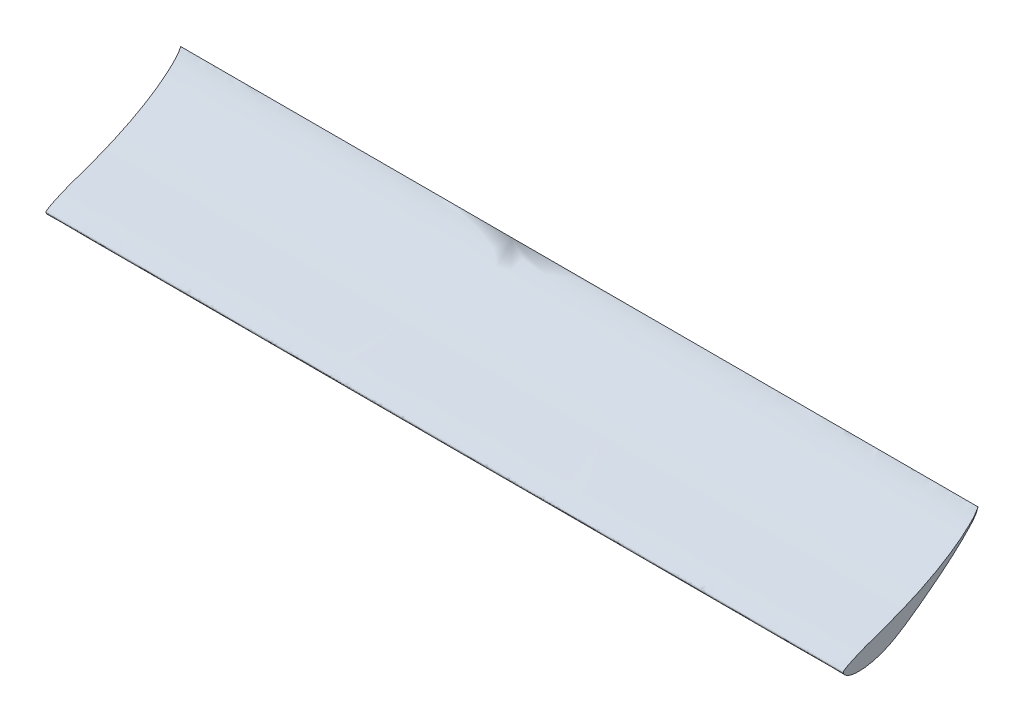
ISO-10303-21;
HEADER;
FILE_DESCRIPTION(('STEP AP214'),'2;1');
FILE_NAME('part.step','',(''),(''),'','','');
FILE_SCHEMA(('AUTOMOTIVE_DESIGN { 1 0 10303 214 1 1 1 1 }'));
ENDSEC;
DATA;
#1=APPLICATION_CONTEXT('core data for automotive mechanical design processes');
#2=APPLICATION_PROTOCOL_DEFINITION('international standard','automotive_design',2000,#1);
#3=PRODUCT_CONTEXT('',#1,'mechanical');
#4=PRODUCT('Part','Part','',(#3));
#5=PRODUCT_RELATED_PRODUCT_CATEGORY('part','',(#4));
#6=PRODUCT_DEFINITION_FORMATION('','',#4);
#7=PRODUCT_DEFINITION_CONTEXT('part definition',#1,'design');
#8=PRODUCT_DEFINITION('design','',#6,#7);
#9=PRODUCT_DEFINITION_SHAPE('','',#8);
#10=(LENGTH_UNIT() NAMED_UNIT(*) SI_UNIT(.MILLI.,.METRE.));
#11=(NAMED_UNIT(*) PLANE_ANGLE_UNIT() SI_UNIT($,.RADIAN.));
#12=(NAMED_UNIT(*) SI_UNIT($,.STERADIAN.) SOLID_ANGLE_UNIT());
#13=UNCERTAINTY_MEASURE_WITH_UNIT(LENGTH_MEASURE(1.E-05),#10,'distance_accuracy_value','');
#14=(GEOMETRIC_REPRESENTATION_CONTEXT(3) GLOBAL_UNCERTAINTY_ASSIGNED_CONTEXT((#13)) GLOBAL_UNIT_ASSIGNED_CONTEXT((#10,
#11,#12)) REPRESENTATION_CONTEXT('',''));
#15=CARTESIAN_POINT('',(0.,0.,0.));
#16=DIRECTION('',(0.,0.,1.));
#17=DIRECTION('',(1.,0.,0.));
#18=AXIS2_PLACEMENT_3D('',#15,#16,#17);
#19=CARTESIAN_POINT('',(-688.586595899993,145.269587710243,1204.4993158128));
#20=DIRECTION('',(1.,0.,0.));
#21=DIRECTION('',(0.,1.,0.));
#22=AXIS2_PLACEMENT_3D('',#19,#20,#21);
#23=PLANE('',#22);
#24=CARTESIAN_POINT('',(-688.586595899993,190.571251708904,1129.08234116518));
#25=CARTESIAN_POINT('',(-688.586595899993,190.674797698661,1129.05134468849));
#26=CARTESIAN_POINT('',(-688.586595899993,190.833716140405,1128.99973699608));
#27=CARTESIAN_POINT('',(-688.586595899993,191.200747810062,1128.84173156688));
#28=CARTESIAN_POINT('',(-688.586595899993,190.738739214956,1129.06517509059));
#29=CARTESIAN_POINT('',(-688.586595899993,190.348697579048,1129.2797612361));
#30=CARTESIAN_POINT('',(-688.586595899993,189.337171570022,1129.8405421731));
#31=CARTESIAN_POINT('',(-688.586595899993,188.106847302026,1130.68300831627));
#32=CARTESIAN_POINT('',(-688.586595899993,186.554596884869,1131.96327948911));
#33=CARTESIAN_POINT('',(-688.586595899993,184.831469505751,1133.62793401361));
#34=CARTESIAN_POINT('',(-688.586595899993,182.949969104319,1135.65292472012));
#35=CARTESIAN_POINT('',(-688.586595899993,180.961441708758,1138.01056452835));
#36=CARTESIAN_POINT('',(-688.586595899993,178.899421573878,1140.67911616637));
#37=CARTESIAN_POINT('',(-688.586595899993,176.796992985566,1143.62744000029));
#38=CARTESIAN_POINT('',(-688.586595899993,174.687104598875,1146.82500955515));
#39=CARTESIAN_POINT('',(-688.586595899993,172.595300147947,1150.2334742542));
#40=CARTESIAN_POINT('',(-688.586595899993,170.546629142447,1153.81443907762));
#41=CARTESIAN_POINT('',(-688.586595899993,168.563077312922,1157.52744982726));
#42=CARTESIAN_POINT('',(-688.586595899993,166.660841178854,1161.32915201794));
#43=CARTESIAN_POINT('',(-688.586595899993,164.853367770911,1165.17611435503));
#44=CARTESIAN_POINT('',(-688.586595899993,163.153813452438,1169.02685293202));
#45=CARTESIAN_POINT('',(-688.586595899993,161.564269346388,1172.83692436655));
#46=CARTESIAN_POINT('',(-688.586595899993,160.089796875776,1176.56673089547));
#47=CARTESIAN_POINT('',(-688.586595899993,158.728781621802,1180.17585420461));
#48=CARTESIAN_POINT('',(-688.586595899993,157.477861297172,1183.6282506999));
#49=CARTESIAN_POINT('',(-688.586595899993,156.329388396914,1186.88883883599));
#50=CARTESIAN_POINT('',(-688.586595899993,155.271152181087,1189.92591511347));
#51=CARTESIAN_POINT('',(-688.586595899993,154.29766743861,1192.71847638379));
#52=CARTESIAN_POINT('',(-688.586595899993,153.346856260829,1195.24742643833));
#53=CARTESIAN_POINT('',(-688.586595899993,152.400543280305,1197.51725154092));
#54=CARTESIAN_POINT('',(-688.586595899993,151.507909873487,1199.55499271616));
#55=CARTESIAN_POINT('',(-688.586595899993,150.678931413454,1201.35396222737));
#56=CARTESIAN_POINT('',(-688.586595899993,149.920130776744,1202.89461919962));
#57=CARTESIAN_POINT('',(-688.586595899993,149.255426553489,1204.16875871201));
#58=CARTESIAN_POINT('',(-688.586595899993,148.649468063477,1205.1372137392));
#59=CARTESIAN_POINT('',(-688.586595899993,148.196057213462,1205.83910817059));
#60=CARTESIAN_POINT('',(-688.586595899993,147.629814428112,1206.22882629082));
#61=CARTESIAN_POINT('',(-688.586595899993,147.031181956059,1206.07579270571));
#62=CARTESIAN_POINT('',(-688.586595899993,146.455393128907,1205.77582613863));
#63=CARTESIAN_POINT('',(-688.586595899993,145.864815206734,1205.26502482805));
#64=CARTESIAN_POINT('',(-688.586595899993,145.466092140081,1204.78364154931));
#65=CARTESIAN_POINT('',(-688.586595899993,145.257414924475,1204.48227091089));
#66=CARTESIAN_POINT('',(-688.586595899993,145.217717204884,1204.42294946577));
#67=(BOUNDED_CURVE() B_SPLINE_CURVE(3,(#24,#25,#26,#27,#28,#29,#30,#31,#32,#33,#34,#35,#36,#37,
#38,#39,#40,#41,#42,#43,#44,#45,#46,#47,#48,#49,#50,#51,#52,#53,#54,#55,#56,#57,#58,#59,#60,#61,
#62,#63,#64,#65,#66),.UNSPECIFIED.,.F.,.F.) B_SPLINE_CURVE_WITH_KNOTS((4,1,1,1,1,1,1,1,1,1,1,1,
1,1,1,1,1,1,1,1,1,1,1,1,1,1,1,1,1,1,1,1,1,1,1,1,1,1,1,1,4),(0.996998715219904,0.999020322442866,
1.,1.0009995943133,1.00414743475004,1.00974820897402,1.01804437692002,1.02886417836525,
1.0418307896412,1.05671380695768,1.07334123241807,1.09150798865944,1.11102183704093,
1.13166170949221,1.15320771511959,1.17543340217029,1.19811031731504,1.22101144631514,
1.24390588249584,1.26657331103561,1.2888103491354,1.31040503599731,1.3311777432043,
1.35094387639145,1.36955639967018,1.3868649633453,1.40275303920837,1.41719587578438,
1.43037951890337,1.44236263317429,1.45303215551185,1.46228434561207,1.47002620600231,
1.47617664482051,1.4806499474091,1.48355307337325,1.48642068931896,1.48995323146334,
1.49409692674396,1.49885058830445,1.49999999980594),
.UNSPECIFIED.) CURVE() GEOMETRIC_REPRESENTATION_ITEM() RATIONAL_B_SPLINE_CURVE((1.,1.,1.,1.,1.,
1.,1.,1.,1.,1.,1.,1.,1.,1.,1.,1.,1.,1.,1.,1.,1.,1.,1.,1.,1.,1.,1.,1.,1.,1.,1.,1.,1.,1.,1.,1.,1.,
1.,1.,1.,1.,1.,1.)) REPRESENTATION_ITEM(''));
#68=CARTESIAN_POINT('',(-688.586595899993,191.110740525895,1128.88280125509));
#69=VERTEX_POINT('',#68);
#70=CARTESIAN_POINT('',(-688.586595899993,145.217717184776,1204.42294943572));
#71=VERTEX_POINT('',#70);
#72=EDGE_CURVE('E10',#69,#71,#67,.T.);
#73=ORIENTED_EDGE('',*,*,#72,.F.);
#74=CARTESIAN_POINT('',(-688.586595899981,145.217717204884,1204.42294946577));
#75=CARTESIAN_POINT('',(-688.586595899981,145.072772227971,1204.20635401438));
#76=CARTESIAN_POINT('',(-688.586595899981,144.753127180918,1203.6631784201));
#77=CARTESIAN_POINT('',(-688.586595899981,144.329077319326,1202.71492751135));
#78=CARTESIAN_POINT('',(-688.586595899981,143.97700955938,1201.53294033539));
#79=CARTESIAN_POINT('',(-688.586595899981,143.730828694012,1200.18989058452));
#80=CARTESIAN_POINT('',(-688.586595899981,143.574626047959,1198.69399984613));
#81=CARTESIAN_POINT('',(-688.586595899981,143.524367662042,1197.05507341267));
#82=CARTESIAN_POINT('',(-688.586595899981,143.585811330687,1195.28653395764));
#83=CARTESIAN_POINT('',(-688.586595899981,143.762893770984,1193.40047073546));
#84=CARTESIAN_POINT('',(-688.586595899981,144.066745056092,1191.40969145735));
#85=CARTESIAN_POINT('',(-688.586595899981,144.494933512867,1189.32625301621));
#86=CARTESIAN_POINT('',(-688.586595899981,145.056763429718,1187.16544440653));
#87=CARTESIAN_POINT('',(-688.586595899981,145.756797678026,1184.94041829879));
#88=CARTESIAN_POINT('',(-688.586595899981,146.618211373589,1182.66726693357));
#89=CARTESIAN_POINT('',(-688.586595899981,147.640380108648,1180.34496076683));
#90=CARTESIAN_POINT('',(-688.586595899981,148.850612635627,1177.9774211872));
#91=CARTESIAN_POINT('',(-688.586595899981,150.239903403986,1175.55825669931));
#92=CARTESIAN_POINT('',(-688.586595899981,151.760208049498,1173.06571692547));
#93=CARTESIAN_POINT('',(-688.586595899981,153.416606879935,1170.52000639781));
#94=CARTESIAN_POINT('',(-688.586595899981,155.18475277462,1167.9265443053));
#95=CARTESIAN_POINT('',(-688.586595899981,157.044896922642,1165.29457045446));
#96=CARTESIAN_POINT('',(-688.586595899981,158.971425704386,1162.63535553441));
#97=CARTESIAN_POINT('',(-688.586595899981,160.945553622552,1159.96877812151));
#98=CARTESIAN_POINT('',(-688.586595899981,162.945429687988,1157.31373084411));
#99=CARTESIAN_POINT('',(-688.586595899981,164.960330291845,1154.69448031266));
#100=CARTESIAN_POINT('',(-688.586595899981,166.977181508911,1152.13087604651));
#101=CARTESIAN_POINT('',(-688.586595899981,168.982449144476,1149.63899604226));
#102=CARTESIAN_POINT('',(-688.586595899981,170.966734270786,1147.23701766396));
#103=CARTESIAN_POINT('',(-688.586595899981,172.91542054103,1144.93694583509));
#104=CARTESIAN_POINT('',(-688.586595899981,174.818498495262,1142.75457142041));
#105=CARTESIAN_POINT('',(-688.586595899981,176.661735349251,1140.70085234567));
#106=CARTESIAN_POINT('',(-688.586595899981,178.434350798044,1138.78860423628));
#107=CARTESIAN_POINT('',(-688.586595899981,180.125636578534,1137.02914191363));
#108=CARTESIAN_POINT('',(-688.586595899981,181.725134547871,1135.43211279782));
#109=CARTESIAN_POINT('',(-688.586595899981,183.222155939456,1134.00526198409));
#110=CARTESIAN_POINT('',(-688.586595899981,184.608774784463,1132.75684345982));
#111=CARTESIAN_POINT('',(-688.586595899981,185.876051490537,1131.69233213667));
#112=CARTESIAN_POINT('',(-688.586595899981,187.016900863582,1130.81601652479));
#113=CARTESIAN_POINT('',(-688.586595899981,188.023685459655,1130.12582420381));
#114=CARTESIAN_POINT('',(-688.586595899981,188.937103159972,1129.6307553976));
#115=CARTESIAN_POINT('',(-688.586595899981,189.727564945528,1129.33974722981));
#116=CARTESIAN_POINT('',(-688.586595899981,190.440686546885,1129.11798830229));
#117=CARTESIAN_POINT('',(-688.586595899981,190.774308844089,1129.02531156125));
#118=CARTESIAN_POINT('',(-688.586595899981,191.109047270949,1128.88120822309));
#119=CARTESIAN_POINT('',(-688.586595899981,191.110740525895,1128.88280125509));
#120=(BOUNDED_CURVE() B_SPLINE_CURVE(3,(#74,#75,#76,#77,#78,#79,#80,#81,#82,#83,#84,#85,#86,#87,
#88,#89,#90,#91,#92,#93,#94,#95,#96,#97,#98,#99,#100,#101,#102,#103,#104,#105,#106,#107,#108,
#109,#110,#111,#112,#113,#114,#115,#116,#117,#118,#119),.UNSPECIFIED.,.F.,
.F.) B_SPLINE_CURVE_WITH_KNOTS((4,1,1,1,1,1,1,1,1,1,1,1,1,1,1,1,1,1,1,1,1,1,1,1,1,1,1,1,1,1,1,1,
1,1,1,1,1,1,1,1,1,1,1,4),(0.499999999805935,0.504196750280793,0.510125492183598,
0.51669103125385,0.524011699263473,0.532092122465354,0.540897920896839,0.550403413935838,
0.56058104089174,0.571396483088815,0.582828080950064,0.594829641292505,0.607347037120814,
0.620384325080165,0.633968936607918,0.648199967415963,0.663193936825189,0.678898580785939,
0.695226562400326,0.712113220733955,0.729459406270428,0.747143116877991,0.765009771536014,
0.782904928287736,0.800688045055655,0.818242104849469,0.835449083117584,0.852211620697039,
0.86842957835941,0.884009362888173,0.898854951230209,0.912881826809319,0.926010749515415,
0.93816677093782,0.949289699209522,0.959322171916738,0.968216949447241,0.975948220006129,
0.982474409223121,0.987904722814407,0.992516501480522,0.996351137832237,0.999020322442866,
1.00000003346582),
.UNSPECIFIED.) CURVE() GEOMETRIC_REPRESENTATION_ITEM() RATIONAL_B_SPLINE_CURVE((1.,1.,1.,1.,1.,
1.,1.,1.,1.,1.,1.,1.,1.,1.,1.,1.,1.,1.,1.,1.,1.,1.,1.,1.,1.,1.,1.,1.,1.,1.,1.,1.,1.,1.,1.,1.,1.,
1.,1.,1.,1.,1.,1.,1.,1.,1.)) REPRESENTATION_ITEM(''));
#121=EDGE_CURVE('E76',#71,#69,#120,.T.);
#122=ORIENTED_EDGE('',*,*,#121,.F.);
#123=EDGE_LOOP('',(#73,#122));
#124=FACE_BOUND('',#123,.T.);
#125=ADVANCED_FACE('F16',(#124),#23,.F.);
#126=CARTESIAN_POINT('',(-231.386595899993,145.269587710243,1204.4993158128));
#127=DIRECTION('',(1.,0.,0.));
#128=DIRECTION('',(0.,1.,0.));
#129=AXIS2_PLACEMENT_3D('',#126,#127,#128);
#130=PLANE('',#129);
#131=CARTESIAN_POINT('',(-231.386595899993,145.217717204884,1204.42294946577));
#132=CARTESIAN_POINT('',(-231.386595899993,145.257414924475,1204.48227091089));
#133=CARTESIAN_POINT('',(-231.386595899993,145.466092140081,1204.78364154931));
#134=CARTESIAN_POINT('',(-231.386595899993,145.864815206734,1205.26502482805));
#135=CARTESIAN_POINT('',(-231.386595899993,146.455393128907,1205.77582613863));
#136=CARTESIAN_POINT('',(-231.386595899993,147.031181956059,1206.07579270571));
#137=CARTESIAN_POINT('',(-231.386595899993,147.629814428112,1206.22882629082));
#138=CARTESIAN_POINT('',(-231.386595899993,148.196057213462,1205.83910817059));
#139=CARTESIAN_POINT('',(-231.386595899993,148.649468063477,1205.1372137392));
#140=CARTESIAN_POINT('',(-231.386595899993,149.255426553489,1204.16875871201));
#141=CARTESIAN_POINT('',(-231.386595899993,149.920130776744,1202.89461919962));
#142=CARTESIAN_POINT('',(-231.386595899993,150.678931413454,1201.35396222737));
#143=CARTESIAN_POINT('',(-231.386595899993,151.507909873487,1199.55499271616));
#144=CARTESIAN_POINT('',(-231.386595899993,152.400543280305,1197.51725154092));
#145=CARTESIAN_POINT('',(-231.386595899993,153.346856260829,1195.24742643833));
#146=CARTESIAN_POINT('',(-231.386595899993,154.29766743861,1192.71847638379));
#147=CARTESIAN_POINT('',(-231.386595899993,155.271152181087,1189.92591511347));
#148=CARTESIAN_POINT('',(-231.386595899993,156.329388396914,1186.88883883599));
#149=CARTESIAN_POINT('',(-231.386595899993,157.477861297172,1183.6282506999));
#150=CARTESIAN_POINT('',(-231.386595899993,158.728781621802,1180.17585420461));
#151=CARTESIAN_POINT('',(-231.386595899993,160.089796875776,1176.56673089547));
#152=CARTESIAN_POINT('',(-231.386595899993,161.564269346388,1172.83692436655));
#153=CARTESIAN_POINT('',(-231.386595899993,163.153813452438,1169.02685293202));
#154=CARTESIAN_POINT('',(-231.386595899993,164.853367770911,1165.17611435503));
#155=CARTESIAN_POINT('',(-231.386595899993,166.660841178854,1161.32915201794));
#156=CARTESIAN_POINT('',(-231.386595899993,168.563077312922,1157.52744982726));
#157=CARTESIAN_POINT('',(-231.386595899993,170.546629142447,1153.81443907762));
#158=CARTESIAN_POINT('',(-231.386595899993,172.595300147947,1150.2334742542));
#159=CARTESIAN_POINT('',(-231.386595899993,174.687104598875,1146.82500955515));
#160=CARTESIAN_POINT('',(-231.386595899993,176.796992985566,1143.62744000029));
#161=CARTESIAN_POINT('',(-231.386595899993,178.899421573878,1140.67911616637));
#162=CARTESIAN_POINT('',(-231.386595899993,180.961441708758,1138.01056452835));
#163=CARTESIAN_POINT('',(-231.386595899993,182.949969104319,1135.65292472012));
#164=CARTESIAN_POINT('',(-231.386595899993,184.831469505751,1133.62793401361));
#165=CARTESIAN_POINT('',(-231.386595899993,186.554596884869,1131.96327948911));
#166=CARTESIAN_POINT('',(-231.386595899993,188.106847302026,1130.68300831627));
#167=CARTESIAN_POINT('',(-231.386595899993,189.337171570022,1129.8405421731));
#168=CARTESIAN_POINT('',(-231.386595899993,190.348697579048,1129.2797612361));
#169=CARTESIAN_POINT('',(-231.386595899993,190.738739214956,1129.06517509059));
#170=CARTESIAN_POINT('',(-231.386595899993,191.200747810062,1128.84173156688));
#171=CARTESIAN_POINT('',(-231.386595899993,190.833716140405,1128.99973699608));
#172=CARTESIAN_POINT('',(-231.386595899993,190.674797698661,1129.05134468849));
#173=CARTESIAN_POINT('',(-231.386595899993,190.571251708904,1129.08234116518));
#174=(BOUNDED_CURVE() B_SPLINE_CURVE(3,(#131,#132,#133,#134,#135,#136,#137,#138,#139,#140,#141,
#142,#143,#144,#145,#146,#147,#148,#149,#150,#151,#152,#153,#154,#155,#156,#157,#158,#159,#160,
#161,#162,#163,#164,#165,#166,#167,#168,#169,#170,#171,#172,#173),.UNSPECIFIED.,.F.,
.F.) B_SPLINE_CURVE_WITH_KNOTS((4,1,1,1,1,1,1,1,1,1,1,1,1,1,1,1,1,1,1,1,1,1,1,1,1,1,1,1,1,1,1,1,
1,1,1,1,1,1,1,1,4),(0.996998715219904,0.998148126721394,1.00290178828188,1.0070454835625,
1.01057802570688,1.01344564165259,1.01634876761674,1.02082207020533,1.02697250902353,
1.03471436941377,1.04396655951399,1.05463608185155,1.06661919612247,1.07980283924146,
1.09424567581747,1.11013375168054,1.12744231535566,1.14605483863439,1.16582097182154,
1.18659367902853,1.20818836589044,1.23042540399023,1.25309283253,1.2759872687107,
1.2988883977108,1.32156531285555,1.34379099990625,1.36533700553363,1.38597687798491,
1.4054907263664,1.42365748260777,1.44028490806816,1.45516792538464,1.46813453666059,
1.47895433810582,1.48725050605182,1.4928512802758,1.49599912071254,1.49699871502584,
1.49797839258297,1.49999999980594),
.UNSPECIFIED.) CURVE() GEOMETRIC_REPRESENTATION_ITEM() RATIONAL_B_SPLINE_CURVE((1.,1.,1.,1.,1.,
1.,1.,1.,1.,1.,1.,1.,1.,1.,1.,1.,1.,1.,1.,1.,1.,1.,1.,1.,1.,1.,1.,1.,1.,1.,1.,1.,1.,1.,1.,1.,1.,
1.,1.,1.,1.,1.,1.)) REPRESENTATION_ITEM(''));
#175=CARTESIAN_POINT('',(-231.386595899993,191.110740525895,1128.88280125509));
#176=VERTEX_POINT('',#175);
#177=CARTESIAN_POINT('',(-231.386595899993,145.217717184776,1204.42294943572));
#178=VERTEX_POINT('',#177);
#179=EDGE_CURVE('E28',#176,#178,#174,.F.);
#180=ORIENTED_EDGE('',*,*,#179,.T.);
#181=CARTESIAN_POINT('',(-231.386595899993,191.110740525895,1128.88280125509));
#182=CARTESIAN_POINT('',(-231.386595899993,191.109047270949,1128.88120822309));
#183=CARTESIAN_POINT('',(-231.386595899993,190.774308844089,1129.02531156125));
#184=CARTESIAN_POINT('',(-231.386595899993,190.440686546885,1129.11798830229));
#185=CARTESIAN_POINT('',(-231.386595899993,189.727564945528,1129.33974722981));
#186=CARTESIAN_POINT('',(-231.386595899993,188.937103159972,1129.6307553976));
#187=CARTESIAN_POINT('',(-231.386595899993,188.023685459655,1130.12582420381));
#188=CARTESIAN_POINT('',(-231.386595899993,187.016900863582,1130.81601652479));
#189=CARTESIAN_POINT('',(-231.386595899993,185.876051490537,1131.69233213667));
#190=CARTESIAN_POINT('',(-231.386595899993,184.608774784463,1132.75684345982));
#191=CARTESIAN_POINT('',(-231.386595899993,183.222155939456,1134.00526198409));
#192=CARTESIAN_POINT('',(-231.386595899993,181.725134547871,1135.43211279782));
#193=CARTESIAN_POINT('',(-231.386595899993,180.125636578534,1137.02914191363));
#194=CARTESIAN_POINT('',(-231.386595899993,178.434350798044,1138.78860423628));
#195=CARTESIAN_POINT('',(-231.386595899993,176.661735349251,1140.70085234567));
#196=CARTESIAN_POINT('',(-231.386595899993,174.818498495262,1142.75457142041));
#197=CARTESIAN_POINT('',(-231.386595899993,172.91542054103,1144.93694583509));
#198=CARTESIAN_POINT('',(-231.386595899993,170.966734270786,1147.23701766396));
#199=CARTESIAN_POINT('',(-231.386595899993,168.982449144476,1149.63899604226));
#200=CARTESIAN_POINT('',(-231.386595899993,166.977181508911,1152.13087604651));
#201=CARTESIAN_POINT('',(-231.386595899993,164.960330291845,1154.69448031266));
#202=CARTESIAN_POINT('',(-231.386595899993,162.945429687988,1157.31373084411));
#203=CARTESIAN_POINT('',(-231.386595899993,160.945553622552,1159.96877812151));
#204=CARTESIAN_POINT('',(-231.386595899993,158.971425704386,1162.63535553441));
#205=CARTESIAN_POINT('',(-231.386595899993,157.044896922642,1165.29457045446));
#206=CARTESIAN_POINT('',(-231.386595899993,155.18475277462,1167.9265443053));
#207=CARTESIAN_POINT('',(-231.386595899993,153.416606879935,1170.52000639781));
#208=CARTESIAN_POINT('',(-231.386595899993,151.760208049498,1173.06571692547));
#209=CARTESIAN_POINT('',(-231.386595899993,150.239903403986,1175.55825669931));
#210=CARTESIAN_POINT('',(-231.386595899993,148.850612635627,1177.9774211872));
#211=CARTESIAN_POINT('',(-231.386595899993,147.640380108648,1180.34496076683));
#212=CARTESIAN_POINT('',(-231.386595899993,146.618211373589,1182.66726693357));
#213=CARTESIAN_POINT('',(-231.386595899993,145.756797678026,1184.94041829879));
#214=CARTESIAN_POINT('',(-231.386595899993,145.056763429718,1187.16544440653));
#215=CARTESIAN_POINT('',(-231.386595899993,144.494933512867,1189.32625301621));
#216=CARTESIAN_POINT('',(-231.386595899993,144.066745056092,1191.40969145735));
#217=CARTESIAN_POINT('',(-231.386595899993,143.762893770984,1193.40047073546));
#218=CARTESIAN_POINT('',(-231.386595899993,143.585811330687,1195.28653395764));
#219=CARTESIAN_POINT('',(-231.386595899993,143.524367662042,1197.05507341267));
#220=CARTESIAN_POINT('',(-231.386595899993,143.574626047959,1198.69399984613));
#221=CARTESIAN_POINT('',(-231.386595899993,143.730828694012,1200.18989058452));
#222=CARTESIAN_POINT('',(-231.386595899993,143.97700955938,1201.53294033539));
#223=CARTESIAN_POINT('',(-231.386595899993,144.329077319326,1202.71492751135));
#224=CARTESIAN_POINT('',(-231.386595899993,144.753127180918,1203.6631784201));
#225=CARTESIAN_POINT('',(-231.386595899993,145.072772227971,1204.20635401438));
#226=CARTESIAN_POINT('',(-231.386595899993,145.217717204884,1204.42294946577));
#227=(BOUNDED_CURVE() B_SPLINE_CURVE(3,(#181,#182,#183,#184,#185,#186,#187,#188,#189,#190,#191,
#192,#193,#194,#195,#196,#197,#198,#199,#200,#201,#202,#203,#204,#205,#206,#207,#208,#209,#210,
#211,#212,#213,#214,#215,#216,#217,#218,#219,#220,#221,#222,#223,#224,#225,#226),.UNSPECIFIED.,
.F.,.F.) B_SPLINE_CURVE_WITH_KNOTS((4,1,1,1,1,1,1,1,1,1,1,1,1,1,1,1,1,1,1,1,1,1,1,1,1,1,1,1,1,1,
1,1,1,1,1,1,1,1,1,1,1,1,1,4),(0.499999999805935,0.500979710828891,0.50364889543952,
0.507483531791235,0.51209531045735,0.517525624048636,0.524051813265628,0.531783083824516,
0.540677861355019,0.550710334062235,0.561833262333937,0.573989283756342,0.587118206462438,
0.601145082041548,0.615990670383584,0.631570454912347,0.647788412574718,0.664550950154173,
0.681757928422288,0.699311988216102,0.717095104984021,0.734990261735743,0.752856916393766,
0.770540627001329,0.787886812537802,0.804773470871431,0.821101452485818,0.836806096446568,
0.851800065855794,0.866031096663839,0.879615708191592,0.892652996150943,0.905170391979252,
0.917171952321693,0.928603550182942,0.939418992380017,0.949596619335919,0.959102112374918,
0.967907910806403,0.975988334008284,0.983309002017907,0.989874541088159,0.995803282990964,
1.00000003346582),
.UNSPECIFIED.) CURVE() GEOMETRIC_REPRESENTATION_ITEM() RATIONAL_B_SPLINE_CURVE((1.,1.,1.,1.,1.,
1.,1.,1.,1.,1.,1.,1.,1.,1.,1.,1.,1.,1.,1.,1.,1.,1.,1.,1.,1.,1.,1.,1.,1.,1.,1.,1.,1.,1.,1.,1.,1.,
1.,1.,1.,1.,1.,1.,1.,1.,1.)) REPRESENTATION_ITEM(''));
#228=EDGE_CURVE('E62',#178,#176,#227,.F.);
#229=ORIENTED_EDGE('',*,*,#228,.T.);
#230=EDGE_LOOP('',(#180,#229));
#231=FACE_BOUND('',#230,.T.);
#232=ADVANCED_FACE('F60',(#231),#130,.T.);
#233=CARTESIAN_POINT('',(-231.386595899993,190.571251708904,1129.08234116518));
#234=CARTESIAN_POINT('',(-688.586595899993,190.571251708904,1129.08234116518));
#235=CARTESIAN_POINT('',(-231.386595899993,190.674797698661,1129.05134468849));
#236=CARTESIAN_POINT('',(-688.586595899993,190.674797698661,1129.05134468849));
#237=CARTESIAN_POINT('',(-231.386595899993,190.833716140405,1128.99973699608));
#238=CARTESIAN_POINT('',(-688.586595899993,190.833716140405,1128.99973699608));
#239=CARTESIAN_POINT('',(-231.386595899993,191.200747810062,1128.84173156688));
#240=CARTESIAN_POINT('',(-688.586595899993,191.200747810062,1128.84173156688));
#241=CARTESIAN_POINT('',(-231.386595899993,190.738739214956,1129.06517509059));
#242=CARTESIAN_POINT('',(-688.586595899993,190.738739214956,1129.06517509059));
#243=CARTESIAN_POINT('',(-231.386595899993,190.348697579048,1129.2797612361));
#244=CARTESIAN_POINT('',(-688.586595899993,190.348697579048,1129.2797612361));
#245=CARTESIAN_POINT('',(-231.386595899993,189.337171570022,1129.8405421731));
#246=CARTESIAN_POINT('',(-688.586595899993,189.337171570022,1129.8405421731));
#247=CARTESIAN_POINT('',(-231.386595899993,188.106847302026,1130.68300831627));
#248=CARTESIAN_POINT('',(-688.586595899993,188.106847302026,1130.68300831627));
#249=CARTESIAN_POINT('',(-231.386595899993,186.554596884869,1131.96327948911));
#250=CARTESIAN_POINT('',(-688.586595899993,186.554596884869,1131.96327948911));
#251=CARTESIAN_POINT('',(-231.386595899993,184.831469505751,1133.62793401361));
#252=CARTESIAN_POINT('',(-688.586595899993,184.831469505751,1133.62793401361));
#253=CARTESIAN_POINT('',(-231.386595899993,182.949969104319,1135.65292472012));
#254=CARTESIAN_POINT('',(-688.586595899993,182.949969104319,1135.65292472012));
#255=CARTESIAN_POINT('',(-231.386595899993,180.961441708758,1138.01056452835));
#256=CARTESIAN_POINT('',(-688.586595899993,180.961441708758,1138.01056452835));
#257=CARTESIAN_POINT('',(-231.386595899993,178.899421573878,1140.67911616637));
#258=CARTESIAN_POINT('',(-688.586595899993,178.899421573878,1140.67911616637));
#259=CARTESIAN_POINT('',(-231.386595899993,176.796992985566,1143.62744000029));
#260=CARTESIAN_POINT('',(-688.586595899993,176.796992985566,1143.62744000029));
#261=CARTESIAN_POINT('',(-231.386595899993,174.687104598875,1146.82500955515));
#262=CARTESIAN_POINT('',(-688.586595899993,174.687104598875,1146.82500955515));
#263=CARTESIAN_POINT('',(-231.386595899993,172.595300147947,1150.2334742542));
#264=CARTESIAN_POINT('',(-688.586595899993,172.595300147947,1150.2334742542));
#265=CARTESIAN_POINT('',(-231.386595899993,170.546629142447,1153.81443907762));
#266=CARTESIAN_POINT('',(-688.586595899993,170.546629142447,1153.81443907762));
#267=CARTESIAN_POINT('',(-231.386595899993,168.563077312922,1157.52744982726));
#268=CARTESIAN_POINT('',(-688.586595899993,168.563077312922,1157.52744982726));
#269=CARTESIAN_POINT('',(-231.386595899993,166.660841178854,1161.32915201794));
#270=CARTESIAN_POINT('',(-688.586595899993,166.660841178854,1161.32915201794));
#271=CARTESIAN_POINT('',(-231.386595899993,164.853367770911,1165.17611435503));
#272=CARTESIAN_POINT('',(-688.586595899993,164.853367770911,1165.17611435503));
#273=CARTESIAN_POINT('',(-231.386595899993,163.153813452438,1169.02685293202));
#274=CARTESIAN_POINT('',(-688.586595899993,163.153813452438,1169.02685293202));
#275=CARTESIAN_POINT('',(-231.386595899993,161.564269346388,1172.83692436655));
#276=CARTESIAN_POINT('',(-688.586595899993,161.564269346388,1172.83692436655));
#277=CARTESIAN_POINT('',(-231.386595899993,160.089796875776,1176.56673089547));
#278=CARTESIAN_POINT('',(-688.586595899993,160.089796875776,1176.56673089547));
#279=CARTESIAN_POINT('',(-231.386595899993,158.728781621802,1180.17585420461));
#280=CARTESIAN_POINT('',(-688.586595899993,158.728781621802,1180.17585420461));
#281=CARTESIAN_POINT('',(-231.386595899993,157.477861297172,1183.6282506999));
#282=CARTESIAN_POINT('',(-688.586595899993,157.477861297172,1183.6282506999));
#283=CARTESIAN_POINT('',(-231.386595899993,156.329388396914,1186.88883883599));
#284=CARTESIAN_POINT('',(-688.586595899993,156.329388396914,1186.88883883599));
#285=CARTESIAN_POINT('',(-231.386595899993,155.271152181087,1189.92591511347));
#286=CARTESIAN_POINT('',(-688.586595899993,155.271152181087,1189.92591511347));
#287=CARTESIAN_POINT('',(-231.386595899993,154.29766743861,1192.71847638379));
#288=CARTESIAN_POINT('',(-688.586595899993,154.29766743861,1192.71847638379));
#289=CARTESIAN_POINT('',(-231.386595899993,153.346856260829,1195.24742643833));
#290=CARTESIAN_POINT('',(-688.586595899993,153.346856260829,1195.24742643833));
#291=CARTESIAN_POINT('',(-231.386595899993,152.400543280305,1197.51725154092));
#292=CARTESIAN_POINT('',(-688.586595899993,152.400543280305,1197.51725154092));
#293=CARTESIAN_POINT('',(-231.386595899993,151.507909873487,1199.55499271616));
#294=CARTESIAN_POINT('',(-688.586595899993,151.507909873487,1199.55499271616));
#295=CARTESIAN_POINT('',(-231.386595899993,150.678931413454,1201.35396222737));
#296=CARTESIAN_POINT('',(-688.586595899993,150.678931413454,1201.35396222737));
#297=CARTESIAN_POINT('',(-231.386595899993,149.920130776744,1202.89461919962));
#298=CARTESIAN_POINT('',(-688.586595899993,149.920130776744,1202.89461919962));
#299=CARTESIAN_POINT('',(-231.386595899993,149.255426553489,1204.16875871201));
#300=CARTESIAN_POINT('',(-688.586595899993,149.255426553489,1204.16875871201));
#301=CARTESIAN_POINT('',(-231.386595899993,148.649468063477,1205.1372137392));
#302=CARTESIAN_POINT('',(-688.586595899993,148.649468063477,1205.1372137392));
#303=CARTESIAN_POINT('',(-231.386595899993,148.196057213462,1205.83910817059));
#304=CARTESIAN_POINT('',(-688.586595899993,148.196057213462,1205.83910817059));
#305=CARTESIAN_POINT('',(-231.386595899993,147.629814428112,1206.22882629082));
#306=CARTESIAN_POINT('',(-688.586595899993,147.629814428112,1206.22882629082));
#307=CARTESIAN_POINT('',(-231.386595899993,147.031181956059,1206.07579270571));
#308=CARTESIAN_POINT('',(-688.586595899993,147.031181956059,1206.07579270571));
#309=CARTESIAN_POINT('',(-231.386595899993,146.455393128907,1205.77582613863));
#310=CARTESIAN_POINT('',(-688.586595899993,146.455393128907,1205.77582613863));
#311=CARTESIAN_POINT('',(-231.386595899993,145.864815206734,1205.26502482805));
#312=CARTESIAN_POINT('',(-688.586595899993,145.864815206734,1205.26502482805));
#313=CARTESIAN_POINT('',(-231.386595899993,145.466092140081,1204.78364154931));
#314=CARTESIAN_POINT('',(-688.586595899993,145.466092140081,1204.78364154931));
#315=CARTESIAN_POINT('',(-231.386595899993,145.257414924475,1204.48227091089));
#316=CARTESIAN_POINT('',(-688.586595899993,145.257414924475,1204.48227091089));
#317=CARTESIAN_POINT('',(-231.386595899993,145.217717204884,1204.42294946577));
#318=CARTESIAN_POINT('',(-688.586595899993,145.217717204884,1204.42294946577));
#319=(BOUNDED_SURFACE() B_SPLINE_SURFACE(3,1,((#233,#234),(#235,#236),(#237,#238),(#239,#240),
(#241,#242),(#243,#244),(#245,#246),(#247,#248),(#249,#250),(#251,#252),(#253,#254),(#255,#256),
(#257,#258),(#259,#260),(#261,#262),(#263,#264),(#265,#266),(#267,#268),(#269,#270),(#271,#272),
(#273,#274),(#275,#276),(#277,#278),(#279,#280),(#281,#282),(#283,#284),(#285,#286),(#287,#288),
(#289,#290),(#291,#292),(#293,#294),(#295,#296),(#297,#298),(#299,#300),(#301,#302),(#303,#304),
(#305,#306),(#307,#308),(#309,#310),(#311,#312),(#313,#314),(#315,#316),(#317,#318)),
.UNSPECIFIED.,.F.,.F.,.F.) B_SPLINE_SURFACE_WITH_KNOTS((4,1,1,1,1,1,1,1,1,1,1,1,1,1,1,1,1,1,1,1,
1,1,1,1,1,1,1,1,1,1,1,1,1,1,1,1,1,1,1,1,4),(2,2),(0.996998715219904,0.999020322442866,1.,
1.0009995943133,1.00414743475004,1.00974820897402,1.01804437692002,1.02886417836525,
1.0418307896412,1.05671380695768,1.07334123241807,1.09150798865944,1.11102183704093,
1.13166170949221,1.15320771511959,1.17543340217029,1.19811031731504,1.22101144631514,
1.24390588249584,1.26657331103561,1.2888103491354,1.31040503599731,1.3311777432043,
1.35094387639145,1.36955639967018,1.3868649633453,1.40275303920837,1.41719587578438,
1.43037951890337,1.44236263317429,1.45303215551185,1.46228434561207,1.47002620600231,
1.47617664482051,1.4806499474091,1.48355307337325,1.48642068931896,1.48995323146334,
1.49409692674396,1.49885058830445,1.49999999980594),(0.,1.),
.UNSPECIFIED.) GEOMETRIC_REPRESENTATION_ITEM() RATIONAL_B_SPLINE_SURFACE(((1.,1.),(1.,1.),(1.,
1.),(1.,1.),(1.,1.),(1.,1.),(1.,1.),(1.,1.),(1.,1.),(1.,1.),(1.,1.),(1.,1.),(1.,1.),(1.,1.),(1.,
1.),(1.,1.),(1.,1.),(1.,1.),(1.,1.),(1.,1.),(1.,1.),(1.,1.),(1.,1.),(1.,1.),(1.,1.),(1.,1.),(1.,
1.),(1.,1.),(1.,1.),(1.,1.),(1.,1.),(1.,1.),(1.,1.),(1.,1.),(1.,1.),(1.,1.),(1.,1.),(1.,1.),(1.,
1.),(1.,1.),(1.,1.),(1.,1.),(1.,1.))) REPRESENTATION_ITEM('') SURFACE());
#320=DIRECTION('',(-1.,0.,0.));
#321=VECTOR('',#320,1.);
#322=CARTESIAN_POINT('',(-256.786595899993,145.217717184776,1204.42294943572));
#323=LINE('',#322,#321);
#324=EDGE_CURVE('E71',#178,#71,#323,.T.);
#325=DIRECTION('',(-1.,0.,0.));
#326=VECTOR('',#325,1.);
#327=CARTESIAN_POINT('',(-256.786595899993,191.110740525895,1128.88280125509));
#328=LINE('',#327,#326);
#329=EDGE_CURVE('E67',#176,#69,#328,.T.);
#330=ORIENTED_EDGE('',*,*,#324,.F.);
#331=ORIENTED_EDGE('',*,*,#179,.F.);
#332=ORIENTED_EDGE('',*,*,#329,.T.);
#333=ORIENTED_EDGE('',*,*,#72,.T.);
#334=EDGE_LOOP('',(#330,#331,#332,#333));
#335=FACE_BOUND('',#334,.T.);
#336=ADVANCED_FACE('F72',(#335),#319,.F.);
#337=CARTESIAN_POINT('',(-231.386595899993,145.217717204884,1204.42294946577));
#338=CARTESIAN_POINT('',(-688.586595899993,145.217717204884,1204.42294946577));
#339=CARTESIAN_POINT('',(-231.386595899993,145.072772227971,1204.20635401438));
#340=CARTESIAN_POINT('',(-688.586595899993,145.072772227971,1204.20635401438));
#341=CARTESIAN_POINT('',(-231.386595899993,144.753127180918,1203.6631784201));
#342=CARTESIAN_POINT('',(-688.586595899993,144.753127180918,1203.6631784201));
#343=CARTESIAN_POINT('',(-231.386595899993,144.329077319326,1202.71492751135));
#344=CARTESIAN_POINT('',(-688.586595899993,144.329077319326,1202.71492751135));
#345=CARTESIAN_POINT('',(-231.386595899993,143.97700955938,1201.53294033539));
#346=CARTESIAN_POINT('',(-688.586595899993,143.97700955938,1201.53294033539));
#347=CARTESIAN_POINT('',(-231.386595899993,143.730828694012,1200.18989058452));
#348=CARTESIAN_POINT('',(-688.586595899993,143.730828694012,1200.18989058452));
#349=CARTESIAN_POINT('',(-231.386595899993,143.574626047959,1198.69399984613));
#350=CARTESIAN_POINT('',(-688.586595899993,143.574626047959,1198.69399984613));
#351=CARTESIAN_POINT('',(-231.386595899993,143.524367662042,1197.05507341267));
#352=CARTESIAN_POINT('',(-688.586595899993,143.524367662042,1197.05507341267));
#353=CARTESIAN_POINT('',(-231.386595899993,143.585811330687,1195.28653395764));
#354=CARTESIAN_POINT('',(-688.586595899993,143.585811330687,1195.28653395764));
#355=CARTESIAN_POINT('',(-231.386595899993,143.762893770984,1193.40047073546));
#356=CARTESIAN_POINT('',(-688.586595899993,143.762893770984,1193.40047073546));
#357=CARTESIAN_POINT('',(-231.386595899993,144.066745056092,1191.40969145735));
#358=CARTESIAN_POINT('',(-688.586595899993,144.066745056092,1191.40969145735));
#359=CARTESIAN_POINT('',(-231.386595899993,144.494933512867,1189.32625301621));
#360=CARTESIAN_POINT('',(-688.586595899993,144.494933512867,1189.32625301621));
#361=CARTESIAN_POINT('',(-231.386595899993,145.056763429718,1187.16544440653));
#362=CARTESIAN_POINT('',(-688.586595899993,145.056763429718,1187.16544440653));
#363=CARTESIAN_POINT('',(-231.386595899993,145.756797678026,1184.94041829879));
#364=CARTESIAN_POINT('',(-688.586595899993,145.756797678026,1184.94041829879));
#365=CARTESIAN_POINT('',(-231.386595899993,146.618211373589,1182.66726693357));
#366=CARTESIAN_POINT('',(-688.586595899993,146.618211373589,1182.66726693357));
#367=CARTESIAN_POINT('',(-231.386595899993,147.640380108648,1180.34496076683));
#368=CARTESIAN_POINT('',(-688.586595899993,147.640380108648,1180.34496076683));
#369=CARTESIAN_POINT('',(-231.386595899993,148.850612635627,1177.9774211872));
#370=CARTESIAN_POINT('',(-688.586595899993,148.850612635627,1177.9774211872));
#371=CARTESIAN_POINT('',(-231.386595899993,150.239903403986,1175.55825669931));
#372=CARTESIAN_POINT('',(-688.586595899993,150.239903403986,1175.55825669931));
#373=CARTESIAN_POINT('',(-231.386595899993,151.760208049498,1173.06571692547));
#374=CARTESIAN_POINT('',(-688.586595899993,151.760208049498,1173.06571692547));
#375=CARTESIAN_POINT('',(-231.386595899993,153.416606879935,1170.52000639781));
#376=CARTESIAN_POINT('',(-688.586595899993,153.416606879935,1170.52000639781));
#377=CARTESIAN_POINT('',(-231.386595899993,155.18475277462,1167.9265443053));
#378=CARTESIAN_POINT('',(-688.586595899993,155.18475277462,1167.9265443053));
#379=CARTESIAN_POINT('',(-231.386595899993,157.044896922642,1165.29457045446));
#380=CARTESIAN_POINT('',(-688.586595899993,157.044896922642,1165.29457045446));
#381=CARTESIAN_POINT('',(-231.386595899993,158.971425704386,1162.63535553441));
#382=CARTESIAN_POINT('',(-688.586595899993,158.971425704386,1162.63535553441));
#383=CARTESIAN_POINT('',(-231.386595899993,160.945553622552,1159.96877812151));
#384=CARTESIAN_POINT('',(-688.586595899993,160.945553622552,1159.96877812151));
#385=CARTESIAN_POINT('',(-231.386595899993,162.945429687988,1157.31373084411));
#386=CARTESIAN_POINT('',(-688.586595899993,162.945429687988,1157.31373084411));
#387=CARTESIAN_POINT('',(-231.386595899993,164.960330291845,1154.69448031266));
#388=CARTESIAN_POINT('',(-688.586595899993,164.960330291845,1154.69448031266));
#389=CARTESIAN_POINT('',(-231.386595899993,166.977181508911,1152.13087604651));
#390=CARTESIAN_POINT('',(-688.586595899993,166.977181508911,1152.13087604651));
#391=CARTESIAN_POINT('',(-231.386595899993,168.982449144476,1149.63899604226));
#392=CARTESIAN_POINT('',(-688.586595899993,168.982449144476,1149.63899604226));
#393=CARTESIAN_POINT('',(-231.386595899993,170.966734270786,1147.23701766396));
#394=CARTESIAN_POINT('',(-688.586595899993,170.966734270786,1147.23701766396));
#395=CARTESIAN_POINT('',(-231.386595899993,172.91542054103,1144.93694583509));
#396=CARTESIAN_POINT('',(-688.586595899993,172.91542054103,1144.93694583509));
#397=CARTESIAN_POINT('',(-231.386595899993,174.818498495262,1142.75457142041));
#398=CARTESIAN_POINT('',(-688.586595899993,174.818498495262,1142.75457142041));
#399=CARTESIAN_POINT('',(-231.386595899993,176.661735349251,1140.70085234567));
#400=CARTESIAN_POINT('',(-688.586595899993,176.661735349251,1140.70085234567));
#401=CARTESIAN_POINT('',(-231.386595899993,178.434350798044,1138.78860423628));
#402=CARTESIAN_POINT('',(-688.586595899993,178.434350798044,1138.78860423628));
#403=CARTESIAN_POINT('',(-231.386595899993,180.125636578534,1137.02914191363));
#404=CARTESIAN_POINT('',(-688.586595899993,180.125636578534,1137.02914191363));
#405=CARTESIAN_POINT('',(-231.386595899993,181.725134547871,1135.43211279782));
#406=CARTESIAN_POINT('',(-688.586595899993,181.725134547871,1135.43211279782));
#407=CARTESIAN_POINT('',(-231.386595899993,183.222155939456,1134.00526198409));
#408=CARTESIAN_POINT('',(-688.586595899993,183.222155939456,1134.00526198409));
#409=CARTESIAN_POINT('',(-231.386595899993,184.608774784463,1132.75684345982));
#410=CARTESIAN_POINT('',(-688.586595899993,184.608774784463,1132.75684345982));
#411=CARTESIAN_POINT('',(-231.386595899993,185.876051490537,1131.69233213667));
#412=CARTESIAN_POINT('',(-688.586595899993,185.876051490537,1131.69233213667));
#413=CARTESIAN_POINT('',(-231.386595899993,187.016900863582,1130.81601652479));
#414=CARTESIAN_POINT('',(-688.586595899993,187.016900863582,1130.81601652479));
#415=CARTESIAN_POINT('',(-231.386595899993,188.023685459655,1130.12582420381));
#416=CARTESIAN_POINT('',(-688.586595899993,188.023685459655,1130.12582420381));
#417=CARTESIAN_POINT('',(-231.386595899993,188.937103159972,1129.6307553976));
#418=CARTESIAN_POINT('',(-688.586595899993,188.937103159972,1129.6307553976));
#419=CARTESIAN_POINT('',(-231.386595899993,189.727564945528,1129.33974722981));
#420=CARTESIAN_POINT('',(-688.586595899993,189.727564945528,1129.33974722981));
#421=CARTESIAN_POINT('',(-231.386595899993,190.440686546885,1129.11798830229));
#422=CARTESIAN_POINT('',(-688.586595899993,190.440686546885,1129.11798830229));
#423=CARTESIAN_POINT('',(-231.386595899993,190.774308844089,1129.02531156125));
#424=CARTESIAN_POINT('',(-688.586595899993,190.774308844089,1129.02531156125));
#425=CARTESIAN_POINT('',(-231.386595899993,191.109047270949,1128.88120822309));
#426=CARTESIAN_POINT('',(-688.586595899993,191.109047270949,1128.88120822309));
#427=CARTESIAN_POINT('',(-231.386595899993,191.110740525895,1128.88280125509));
#428=CARTESIAN_POINT('',(-688.586595899993,191.110740525895,1128.88280125509));
#429=(BOUNDED_SURFACE() B_SPLINE_SURFACE(3,1,((#337,#338),(#339,#340),(#341,#342),(#343,#344),
(#345,#346),(#347,#348),(#349,#350),(#351,#352),(#353,#354),(#355,#356),(#357,#358),(#359,#360),
(#361,#362),(#363,#364),(#365,#366),(#367,#368),(#369,#370),(#371,#372),(#373,#374),(#375,#376),
(#377,#378),(#379,#380),(#381,#382),(#383,#384),(#385,#386),(#387,#388),(#389,#390),(#391,#392),
(#393,#394),(#395,#396),(#397,#398),(#399,#400),(#401,#402),(#403,#404),(#405,#406),(#407,#408),
(#409,#410),(#411,#412),(#413,#414),(#415,#416),(#417,#418),(#419,#420),(#421,#422),(#423,#424),
(#425,#426),(#427,#428)),.UNSPECIFIED.,.F.,.F.,.F.) B_SPLINE_SURFACE_WITH_KNOTS((4,1,1,1,1,1,1,
1,1,1,1,1,1,1,1,1,1,1,1,1,1,1,1,1,1,1,1,1,1,1,1,1,1,1,1,1,1,1,1,1,1,1,1,4),(2,2),
(0.499999999805935,0.504196750280793,0.510125492183598,0.51669103125385,0.524011699263473,
0.532092122465354,0.540897920896839,0.550403413935838,0.56058104089174,0.571396483088815,
0.582828080950064,0.594829641292505,0.607347037120814,0.620384325080165,0.633968936607918,
0.648199967415963,0.663193936825189,0.678898580785939,0.695226562400326,0.712113220733955,
0.729459406270428,0.747143116877991,0.765009771536014,0.782904928287736,0.800688045055655,
0.818242104849469,0.835449083117584,0.852211620697039,0.86842957835941,0.884009362888173,
0.898854951230209,0.912881826809319,0.926010749515415,0.93816677093782,0.949289699209522,
0.959322171916738,0.968216949447241,0.975948220006129,0.982474409223121,0.987904722814407,
0.992516501480522,0.996351137832237,0.999020322442866,1.00000003346582),(0.,1.),
.UNSPECIFIED.) GEOMETRIC_REPRESENTATION_ITEM() RATIONAL_B_SPLINE_SURFACE(((1.,1.),(1.,1.),(1.,
1.),(1.,1.),(1.,1.),(1.,1.),(1.,1.),(1.,1.),(1.,1.),(1.,1.),(1.,1.),(1.,1.),(1.,1.),(1.,1.),(1.,
1.),(1.,1.),(1.,1.),(1.,1.),(1.,1.),(1.,1.),(1.,1.),(1.,1.),(1.,1.),(1.,1.),(1.,1.),(1.,1.),(1.,
1.),(1.,1.),(1.,1.),(1.,1.),(1.,1.),(1.,1.),(1.,1.),(1.,1.),(1.,1.),(1.,1.),(1.,1.),(1.,1.),(1.,
1.),(1.,1.),(1.,1.),(1.,1.),(1.,1.),(1.,1.),(1.,1.),(1.,1.))) REPRESENTATION_ITEM('') SURFACE());
#430=ORIENTED_EDGE('',*,*,#228,.F.);
#431=ORIENTED_EDGE('',*,*,#324,.T.);
#432=ORIENTED_EDGE('',*,*,#121,.T.);
#433=ORIENTED_EDGE('',*,*,#329,.F.);
#434=EDGE_LOOP('',(#430,#431,#432,#433));
#435=FACE_BOUND('',#434,.T.);
#436=ADVANCED_FACE('F78',(#435),#429,.F.);
#437=CLOSED_SHELL('',(#125,#232,#336,#436));
#438=MANIFOLD_SOLID_BREP('B1',#437);
#439=ADVANCED_BREP_SHAPE_REPRESENTATION('',(#18,#438),#14);
#440=SHAPE_DEFINITION_REPRESENTATION(#9,#439);
ENDSEC;
END-ISO-10303-21;
